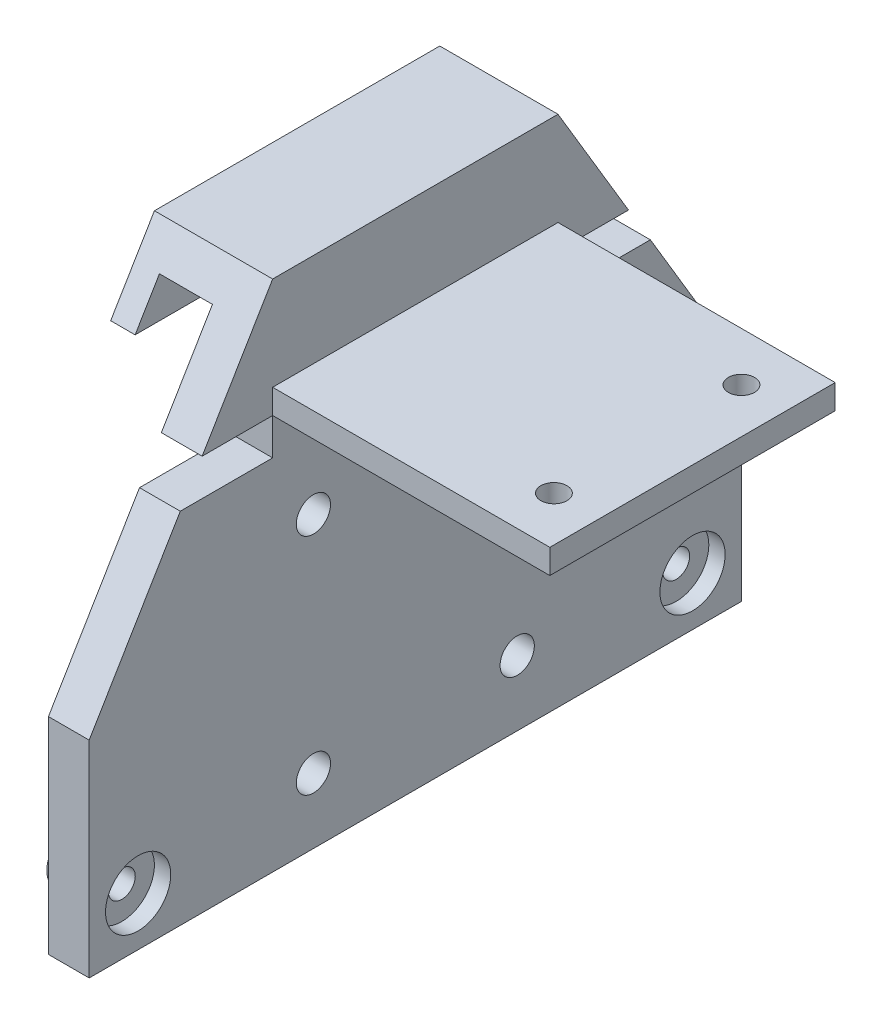
ISO-10303-21;
HEADER;
FILE_DESCRIPTION(('STEP AP214'),'2;1');
FILE_NAME('part.step','',(''),(''),'','','');
FILE_SCHEMA(('AUTOMOTIVE_DESIGN { 1 0 10303 214 1 1 1 1 }'));
ENDSEC;
DATA;
#1=APPLICATION_CONTEXT('core data for automotive mechanical design processes');
#2=APPLICATION_PROTOCOL_DEFINITION('international standard','automotive_design',2000,#1);
#3=PRODUCT_CONTEXT('',#1,'mechanical');
#4=PRODUCT('Part','Part','',(#3));
#5=PRODUCT_RELATED_PRODUCT_CATEGORY('part','',(#4));
#6=PRODUCT_DEFINITION_FORMATION('','',#4);
#7=PRODUCT_DEFINITION_CONTEXT('part definition',#1,'design');
#8=PRODUCT_DEFINITION('design','',#6,#7);
#9=PRODUCT_DEFINITION_SHAPE('','',#8);
#10=(LENGTH_UNIT() NAMED_UNIT(*) SI_UNIT(.MILLI.,.METRE.));
#11=(NAMED_UNIT(*) PLANE_ANGLE_UNIT() SI_UNIT($,.RADIAN.));
#12=(NAMED_UNIT(*) SI_UNIT($,.STERADIAN.) SOLID_ANGLE_UNIT());
#13=UNCERTAINTY_MEASURE_WITH_UNIT(LENGTH_MEASURE(1.E-05),#10,'distance_accuracy_value','');
#14=(GEOMETRIC_REPRESENTATION_CONTEXT(3) GLOBAL_UNCERTAINTY_ASSIGNED_CONTEXT((#13)) GLOBAL_UNIT_ASSIGNED_CONTEXT((#10,
#11,#12)) REPRESENTATION_CONTEXT('',''));
#15=CARTESIAN_POINT('',(0.,0.,0.));
#16=DIRECTION('',(0.,0.,1.));
#17=DIRECTION('',(1.,0.,0.));
#18=AXIS2_PLACEMENT_3D('',#15,#16,#17);
#19=CARTESIAN_POINT('',(5.,0.,0.));
#20=DIRECTION('',(1.,0.,0.));
#21=DIRECTION('',(0.,0.,-1.));
#22=AXIS2_PLACEMENT_3D('',#19,#20,#21);
#23=PLANE('',#22);
#24=DIRECTION('',(0.,1.,0.));
#25=VECTOR('',#24,1.);
#26=CARTESIAN_POINT('',(5.,17.,-17.5));
#27=LINE('',#26,#25);
#28=CARTESIAN_POINT('',(5.,17.,-17.5));
#29=VERTEX_POINT('',#28);
#30=CARTESIAN_POINT('',(5.,20.,-17.5));
#31=VERTEX_POINT('',#30);
#32=EDGE_CURVE('E209',#29,#31,#27,.T.);
#33=ORIENTED_EDGE('',*,*,#32,.F.);
#34=DIRECTION('',(0.,0.,1.));
#35=VECTOR('',#34,1.);
#36=CARTESIAN_POINT('',(5.,17.,-17.5));
#37=LINE('',#36,#35);
#38=CARTESIAN_POINT('',(5.,17.,-26.1466267724151));
#39=VERTEX_POINT('',#38);
#40=EDGE_CURVE('E241',#39,#29,#37,.T.);
#41=ORIENTED_EDGE('',*,*,#40,.F.);
#42=DIRECTION('',(0.,-0.858884544740258,-0.512169248204458));
#43=VECTOR('',#42,1.);
#44=CARTESIAN_POINT('',(5.,-6.23147709356677,-40.));
#45=LINE('',#44,#43);
#46=CARTESIAN_POINT('',(5.,31.5,-17.5));
#47=VERTEX_POINT('',#46);
#48=EDGE_CURVE('E335',#47,#39,#45,.T.);
#49=ORIENTED_EDGE('',*,*,#48,.F.);
#50=DIRECTION('',(0.,0.,1.));
#51=VECTOR('',#50,1.);
#52=CARTESIAN_POINT('',(5.,31.5,40.));
#53=LINE('',#52,#51);
#54=CARTESIAN_POINT('',(5.,31.5,17.5));
#55=VERTEX_POINT('',#54);
#56=EDGE_CURVE('E419',#47,#55,#53,.T.);
#57=ORIENTED_EDGE('',*,*,#56,.T.);
#58=DIRECTION('',(0.,0.858884544740258,-0.512169248204458));
#59=VECTOR('',#58,1.);
#60=CARTESIAN_POINT('',(5.,31.5,17.5));
#61=LINE('',#60,#59);
#62=CARTESIAN_POINT('',(5.,17.,26.1466267724151));
#63=VERTEX_POINT('',#62);
#64=EDGE_CURVE('E322',#63,#55,#61,.T.);
#65=ORIENTED_EDGE('',*,*,#64,.F.);
#66=DIRECTION('',(0.,0.,1.));
#67=VECTOR('',#66,1.);
#68=CARTESIAN_POINT('',(5.,17.,17.5));
#69=LINE('',#68,#67);
#70=CARTESIAN_POINT('',(5.,17.,17.5));
#71=VERTEX_POINT('',#70);
#72=EDGE_CURVE('E269',#71,#63,#69,.T.);
#73=ORIENTED_EDGE('',*,*,#72,.F.);
#74=DIRECTION('',(0.,-1.,0.));
#75=VECTOR('',#74,1.);
#76=CARTESIAN_POINT('',(5.,17.,17.5));
#77=LINE('',#76,#75);
#78=CARTESIAN_POINT('',(5.,20.,17.5));
#79=VERTEX_POINT('',#78);
#80=EDGE_CURVE('E498',#79,#71,#77,.T.);
#81=ORIENTED_EDGE('',*,*,#80,.F.);
#82=DIRECTION('',(0.,0.,1.));
#83=VECTOR('',#82,1.);
#84=CARTESIAN_POINT('',(5.,20.,17.5));
#85=LINE('',#84,#83);
#86=EDGE_CURVE('E58',#31,#79,#85,.T.);
#87=ORIENTED_EDGE('',*,*,#86,.F.);
#88=EDGE_LOOP('',(#33,#41,#49,#57,#65,#73,#81,#87));
#89=FACE_BOUND('',#88,.T.);
#90=ADVANCED_FACE('F40',(#89),#23,.T.);
#91=CARTESIAN_POINT('',(-9.5,-6.23147709356677,-40.));
#92=DIRECTION('',(0.,-0.512169248204458,0.858884544740258));
#93=DIRECTION('',(0.,-0.858884544740258,-0.512169248204458));
#94=AXIS2_PLACEMENT_3D('',#91,#92,#93);
#95=PLANE('',#94);
#96=ORIENTED_EDGE('',*,*,#48,.T.);
#97=DIRECTION('',(1.,0.,0.));
#98=VECTOR('',#97,1.);
#99=CARTESIAN_POINT('',(-9.501,17.,-26.1466267724151));
#100=LINE('',#99,#98);
#101=CARTESIAN_POINT('',(0.,17.,-26.1466267724151));
#102=VERTEX_POINT('',#101);
#103=EDGE_CURVE('E224',#102,#39,#100,.T.);
#104=ORIENTED_EDGE('',*,*,#103,.F.);
#105=DIRECTION('',(0.,-0.858884544740258,-0.512169248204458));
#106=VECTOR('',#105,1.);
#107=CARTESIAN_POINT('',(0.,15.9611455749449,-26.7661154954719));
#108=LINE('',#107,#106);
#109=CARTESIAN_POINT('',(0.,27.5,-19.8852763510111));
#110=VERTEX_POINT('',#109);
#111=EDGE_CURVE('E354',#110,#102,#108,.T.);
#112=ORIENTED_EDGE('',*,*,#111,.F.);
#113=DIRECTION('',(-1.,0.,0.));
#114=VECTOR('',#113,1.);
#115=CARTESIAN_POINT('',(0.,27.5,-19.8852763510111));
#116=LINE('',#115,#114);
#117=CARTESIAN_POINT('',(-6.5,27.5,-19.8852763510111));
#118=VERTEX_POINT('',#117);
#119=EDGE_CURVE('E350',#110,#118,#116,.T.);
#120=ORIENTED_EDGE('',*,*,#119,.T.);
#121=DIRECTION('',(0.,-0.858884544740258,-0.512169248204458));
#122=VECTOR('',#121,1.);
#123=CARTESIAN_POINT('',(-6.49999999999999,12.8950815209415,-28.5944680151467));
#124=LINE('',#123,#122);
#125=CARTESIAN_POINT('',(-6.5,22.5,-22.8668717897749));
#126=VERTEX_POINT('',#125);
#127=EDGE_CURVE('E347',#118,#126,#124,.T.);
#128=ORIENTED_EDGE('',*,*,#127,.T.);
#129=DIRECTION('',(-1.,0.,0.));
#130=VECTOR('',#129,1.);
#131=CARTESIAN_POINT('',(-6.5,22.5,-22.8668717897749));
#132=LINE('',#131,#130);
#133=CARTESIAN_POINT('',(-9.5,22.5,-22.8668717897749));
#134=VERTEX_POINT('',#133);
#135=EDGE_CURVE('E327',#126,#134,#132,.T.);
#136=ORIENTED_EDGE('',*,*,#135,.T.);
#137=DIRECTION('',(0.,-0.858884544740258,-0.512169248204458));
#138=VECTOR('',#137,1.);
#139=CARTESIAN_POINT('',(-9.5,-6.23147709356677,-40.));
#140=LINE('',#139,#138);
#141=CARTESIAN_POINT('',(-9.5,31.5,-17.5));
#142=VERTEX_POINT('',#141);
#143=EDGE_CURVE('E330',#142,#134,#140,.T.);
#144=ORIENTED_EDGE('',*,*,#143,.F.);
#145=DIRECTION('',(1.,0.,0.));
#146=VECTOR('',#145,1.);
#147=CARTESIAN_POINT('',(-9.5,31.5,-17.5));
#148=LINE('',#147,#146);
#149=EDGE_CURVE('E339',#142,#47,#148,.T.);
#150=ORIENTED_EDGE('',*,*,#149,.T.);
#151=EDGE_LOOP('',(#96,#104,#112,#120,#128,#136,#144,#150));
#152=FACE_BOUND('',#151,.T.);
#153=ADVANCED_FACE('F575',(#152),#95,.F.);
#154=CARTESIAN_POINT('',(-9.5,31.5,17.5));
#155=DIRECTION('',(0.,-0.512169248204458,-0.858884544740258));
#156=DIRECTION('',(0.,0.858884544740258,-0.512169248204458));
#157=AXIS2_PLACEMENT_3D('',#154,#155,#156);
#158=PLANE('',#157);
#159=CARTESIAN_POINT('',(5.,-6.23147709356677,40.));
#160=VERTEX_POINT('',#159);
#161=CARTESIAN_POINT('',(5.,12.5,28.8300626673025));
#162=VERTEX_POINT('',#161);
#163=EDGE_CURVE('E317',#160,#162,#61,.T.);
#164=ORIENTED_EDGE('',*,*,#163,.T.);
#165=DIRECTION('',(1.,0.,0.));
#166=VECTOR('',#165,1.);
#167=CARTESIAN_POINT('',(-9.501,12.5,28.8300626673025));
#168=LINE('',#167,#166);
#169=CARTESIAN_POINT('',(0.,12.5,28.8300626673025));
#170=VERTEX_POINT('',#169);
#171=EDGE_CURVE('E215',#170,#162,#168,.T.);
#172=ORIENTED_EDGE('',*,*,#171,.F.);
#173=DIRECTION('',(0.,0.858884544740258,-0.512169248204458));
#174=VECTOR('',#173,1.);
#175=CARTESIAN_POINT('',(0.,15.9611455749449,26.7661154954719));
#176=LINE('',#175,#174);
#177=CARTESIAN_POINT('',(0.,-6.23147709356677,40.));
#178=VERTEX_POINT('',#177);
#179=EDGE_CURVE('E369',#178,#170,#176,.T.);
#180=ORIENTED_EDGE('',*,*,#179,.F.);
#181=DIRECTION('',(1.,0.,0.));
#182=VECTOR('',#181,1.);
#183=CARTESIAN_POINT('',(-9.5,-6.23147709356677,40.));
#184=LINE('',#183,#182);
#185=EDGE_CURVE('E321',#178,#160,#184,.T.);
#186=ORIENTED_EDGE('',*,*,#185,.T.);
#187=EDGE_LOOP('',(#164,#172,#180,#186));
#188=FACE_BOUND('',#187,.T.);
#189=ADVANCED_FACE('F573',(#188),#158,.F.);
#190=CARTESIAN_POINT('',(0.,0.,0.));
#191=DIRECTION('',(1.,0.,0.));
#192=DIRECTION('',(0.,0.,-1.));
#193=AXIS2_PLACEMENT_3D('',#190,#191,#192);
#194=PLANE('',#193);
#195=CARTESIAN_POINT('',(0.,-23.5,-12.5));
#196=DIRECTION('',(-1.,0.,0.));
#197=DIRECTION('',(0.,0.,1.));
#198=AXIS2_PLACEMENT_3D('',#195,#196,#197);
#199=CIRCLE('',#198,2.1);
#200=CARTESIAN_POINT('',(0.,-23.5,-10.4));
#201=VERTEX_POINT('',#200);
#202=EDGE_CURVE('E290',#201,#201,#199,.T.);
#203=ORIENTED_EDGE('',*,*,#202,.F.);
#204=EDGE_LOOP('',(#203));
#205=FACE_BOUND('',#204,.T.);
#206=CARTESIAN_POINT('',(0.,-23.5,12.5));
#207=DIRECTION('',(-1.,0.,0.));
#208=DIRECTION('',(0.,0.,1.));
#209=AXIS2_PLACEMENT_3D('',#206,#207,#208);
#210=CIRCLE('',#209,2.1);
#211=CARTESIAN_POINT('',(0.,-23.5,14.6));
#212=VERTEX_POINT('',#211);
#213=EDGE_CURVE('E255',#212,#212,#210,.T.);
#214=ORIENTED_EDGE('',*,*,#213,.F.);
#215=EDGE_LOOP('',(#214));
#216=FACE_BOUND('',#215,.T.);
#217=CARTESIAN_POINT('',(0.,4.,12.5));
#218=DIRECTION('',(1.,0.,0.));
#219=DIRECTION('',(0.,0.,-1.));
#220=AXIS2_PLACEMENT_3D('',#217,#218,#219);
#221=CIRCLE('',#220,2.1);
#222=CARTESIAN_POINT('',(0.,4.,10.4));
#223=VERTEX_POINT('',#222);
#224=EDGE_CURVE('E312',#223,#223,#221,.T.);
#225=ORIENTED_EDGE('',*,*,#224,.T.);
#226=EDGE_LOOP('',(#225));
#227=FACE_BOUND('',#226,.T.);
#228=CARTESIAN_POINT('',(0.,4.,-12.5));
#229=DIRECTION('',(1.,0.,0.));
#230=DIRECTION('',(0.,0.,-1.));
#231=AXIS2_PLACEMENT_3D('',#228,#229,#230);
#232=CIRCLE('',#231,2.1);
#233=CARTESIAN_POINT('',(0.,4.,-14.6));
#234=VERTEX_POINT('',#233);
#235=EDGE_CURVE('E305',#234,#234,#232,.T.);
#236=ORIENTED_EDGE('',*,*,#235,.T.);
#237=EDGE_LOOP('',(#236));
#238=FACE_BOUND('',#237,.T.);
#239=CARTESIAN_POINT('',(0.,-25.5,-34.));
#240=DIRECTION('',(1.,0.,0.));
#241=DIRECTION('',(0.,0.,-1.));
#242=AXIS2_PLACEMENT_3D('',#239,#240,#241);
#243=CIRCLE('',#242,3.2);
#244=CARTESIAN_POINT('',(0.,-25.5,-37.2));
#245=VERTEX_POINT('',#244);
#246=EDGE_CURVE('E456',#245,#245,#243,.F.);
#247=ORIENTED_EDGE('',*,*,#246,.F.);
#248=EDGE_LOOP('',(#247));
#249=FACE_BOUND('',#248,.T.);
#250=ORIENTED_EDGE('',*,*,#111,.T.);
#251=DIRECTION('',(0.,0.,-1.));
#252=VECTOR('',#251,1.);
#253=CARTESIAN_POINT('',(0.,17.,-17.5));
#254=LINE('',#253,#252);
#255=CARTESIAN_POINT('',(0.,17.,-17.5));
#256=VERTEX_POINT('',#255);
#257=EDGE_CURVE('E232',#256,#102,#254,.T.);
#258=ORIENTED_EDGE('',*,*,#257,.F.);
#259=DIRECTION('',(0.,1.,0.));
#260=VECTOR('',#259,1.);
#261=CARTESIAN_POINT('',(0.,17.,-17.5));
#262=LINE('',#261,#260);
#263=CARTESIAN_POINT('',(0.,12.5,-17.5));
#264=VERTEX_POINT('',#263);
#265=EDGE_CURVE('E228',#264,#256,#262,.T.);
#266=ORIENTED_EDGE('',*,*,#265,.F.);
#267=DIRECTION('',(0.,0.,1.));
#268=VECTOR('',#267,1.);
#269=CARTESIAN_POINT('',(0.,12.5,-17.5));
#270=LINE('',#269,#268);
#271=CARTESIAN_POINT('',(0.,12.5,-28.8300626673025));
#272=VERTEX_POINT('',#271);
#273=EDGE_CURVE('E250',#272,#264,#270,.T.);
#274=ORIENTED_EDGE('',*,*,#273,.F.);
#275=CARTESIAN_POINT('',(0.,-6.23147709356677,-40.));
#276=VERTEX_POINT('',#275);
#277=EDGE_CURVE('E353',#272,#276,#108,.T.);
#278=ORIENTED_EDGE('',*,*,#277,.T.);
#279=DIRECTION('',(0.,1.,0.));
#280=VECTOR('',#279,1.);
#281=CARTESIAN_POINT('',(0.,31.5,-40.));
#282=LINE('',#281,#280);
#283=CARTESIAN_POINT('',(0.,-31.5,-40.));
#284=VERTEX_POINT('',#283);
#285=EDGE_CURVE('E437',#284,#276,#282,.T.);
#286=ORIENTED_EDGE('',*,*,#285,.F.);
#287=DIRECTION('',(0.,0.,-1.));
#288=VECTOR('',#287,1.);
#289=CARTESIAN_POINT('',(0.,-31.5,40.));
#290=LINE('',#289,#288);
#291=CARTESIAN_POINT('',(0.,-31.5,40.));
#292=VERTEX_POINT('',#291);
#293=EDGE_CURVE('E445',#292,#284,#290,.T.);
#294=ORIENTED_EDGE('',*,*,#293,.F.);
#295=DIRECTION('',(0.,-1.,0.));
#296=VECTOR('',#295,1.);
#297=CARTESIAN_POINT('',(0.,31.5,40.));
#298=LINE('',#297,#296);
#299=EDGE_CURVE('E441',#178,#292,#298,.T.);
#300=ORIENTED_EDGE('',*,*,#299,.F.);
#301=ORIENTED_EDGE('',*,*,#179,.T.);
#302=DIRECTION('',(0.,0.,1.));
#303=VECTOR('',#302,1.);
#304=CARTESIAN_POINT('',(0.,12.5,17.5));
#305=LINE('',#304,#303);
#306=CARTESIAN_POINT('',(0.,12.5,17.5));
#307=VERTEX_POINT('',#306);
#308=EDGE_CURVE('E262',#307,#170,#305,.T.);
#309=ORIENTED_EDGE('',*,*,#308,.F.);
#310=DIRECTION('',(0.,-1.,0.));
#311=VECTOR('',#310,1.);
#312=CARTESIAN_POINT('',(0.,17.,17.5));
#313=LINE('',#312,#311);
#314=CARTESIAN_POINT('',(0.,17.,17.5));
#315=VERTEX_POINT('',#314);
#316=EDGE_CURVE('E259',#315,#307,#313,.T.);
#317=ORIENTED_EDGE('',*,*,#316,.F.);
#318=DIRECTION('',(0.,0.,-1.));
#319=VECTOR('',#318,1.);
#320=CARTESIAN_POINT('',(0.,17.,17.5));
#321=LINE('',#320,#319);
#322=CARTESIAN_POINT('',(0.,17.,26.1466267724151));
#323=VERTEX_POINT('',#322);
#324=EDGE_CURVE('E225',#323,#315,#321,.T.);
#325=ORIENTED_EDGE('',*,*,#324,.F.);
#326=CARTESIAN_POINT('',(0.,27.5,19.8852763510111));
#327=VERTEX_POINT('',#326);
#328=EDGE_CURVE('E368',#323,#327,#176,.T.);
#329=ORIENTED_EDGE('',*,*,#328,.T.);
#330=DIRECTION('',(0.,0.,1.));
#331=VECTOR('',#330,1.);
#332=CARTESIAN_POINT('',(0.,27.5,-53.0862523283024));
#333=LINE('',#332,#331);
#334=EDGE_CURVE('E374',#110,#327,#333,.T.);
#335=ORIENTED_EDGE('',*,*,#334,.F.);
#336=EDGE_LOOP('',(#250,#258,#266,#274,#278,#286,#294,#300,#301,#309,#317,#325,#329,#335));
#337=FACE_BOUND('',#336,.T.);
#338=CARTESIAN_POINT('',(0.,-25.5,34.));
#339=DIRECTION('',(1.,0.,0.));
#340=DIRECTION('',(0.,0.,-1.));
#341=AXIS2_PLACEMENT_3D('',#338,#339,#340);
#342=CIRCLE('',#341,3.2);
#343=CARTESIAN_POINT('',(0.,-25.5,30.8));
#344=VERTEX_POINT('',#343);
#345=EDGE_CURVE('E50',#344,#344,#342,.F.);
#346=ORIENTED_EDGE('',*,*,#345,.F.);
#347=EDGE_LOOP('',(#346));
#348=FACE_BOUND('',#347,.T.);
#349=ADVANCED_FACE('F553',(#205,#216,#227,#238,#249,#337,#348),#194,.F.);
#350=CARTESIAN_POINT('',(10.,31.5,-40.));
#351=DIRECTION('',(0.,0.,1.));
#352=DIRECTION('',(0.,-1.,0.));
#353=AXIS2_PLACEMENT_3D('',#350,#351,#352);
#354=PLANE('',#353);
#355=ORIENTED_EDGE('',*,*,#285,.T.);
#356=DIRECTION('',(1.,0.,0.));
#357=VECTOR('',#356,1.);
#358=CARTESIAN_POINT('',(-9.5,-6.23147709356677,-40.));
#359=LINE('',#358,#357);
#360=CARTESIAN_POINT('',(5.,-6.23147709356677,-40.));
#361=VERTEX_POINT('',#360);
#362=EDGE_CURVE('E334',#276,#361,#359,.T.);
#363=ORIENTED_EDGE('',*,*,#362,.T.);
#364=DIRECTION('',(0.,1.,0.));
#365=VECTOR('',#364,1.);
#366=CARTESIAN_POINT('',(5.,31.5,-40.));
#367=LINE('',#366,#365);
#368=CARTESIAN_POINT('',(5.,-31.5,-40.));
#369=VERTEX_POINT('',#368);
#370=EDGE_CURVE('E415',#369,#361,#367,.T.);
#371=ORIENTED_EDGE('',*,*,#370,.F.);
#372=DIRECTION('',(-1.,0.,0.));
#373=VECTOR('',#372,1.);
#374=CARTESIAN_POINT('',(10.,-31.5,-40.));
#375=LINE('',#374,#373);
#376=EDGE_CURVE('E449',#369,#284,#375,.T.);
#377=ORIENTED_EDGE('',*,*,#376,.T.);
#378=EDGE_LOOP('',(#355,#363,#371,#377));
#379=FACE_BOUND('',#378,.T.);
#380=ADVANCED_FACE('F42',(#379),#354,.F.);
#381=CARTESIAN_POINT('',(10.,31.5,40.));
#382=DIRECTION('',(0.,-1.,0.));
#383=DIRECTION('',(0.,0.,-1.));
#384=AXIS2_PLACEMENT_3D('',#381,#382,#383);
#385=PLANE('',#384);
#386=DIRECTION('',(0.,0.,1.));
#387=VECTOR('',#386,1.);
#388=CARTESIAN_POINT('',(-9.5,31.5,-53.0862523283024));
#389=LINE('',#388,#387);
#390=CARTESIAN_POINT('',(-9.5,31.5,17.5));
#391=VERTEX_POINT('',#390);
#392=EDGE_CURVE('E373',#142,#391,#389,.T.);
#393=ORIENTED_EDGE('',*,*,#392,.T.);
#394=DIRECTION('',(1.,0.,0.));
#395=VECTOR('',#394,1.);
#396=CARTESIAN_POINT('',(-9.5,31.5,17.5));
#397=LINE('',#396,#395);
#398=EDGE_CURVE('E323',#391,#55,#397,.T.);
#399=ORIENTED_EDGE('',*,*,#398,.T.);
#400=ORIENTED_EDGE('',*,*,#56,.F.);
#401=ORIENTED_EDGE('',*,*,#149,.F.);
#402=EDGE_LOOP('',(#393,#399,#400,#401));
#403=FACE_BOUND('',#402,.T.);
#404=ADVANCED_FACE('F635',(#403),#385,.F.);
#405=CARTESIAN_POINT('',(10.,31.5,40.));
#406=DIRECTION('',(0.,0.,-1.));
#407=DIRECTION('',(-1.,0.,0.));
#408=AXIS2_PLACEMENT_3D('',#405,#406,#407);
#409=PLANE('',#408);
#410=DIRECTION('',(0.,-1.,0.));
#411=VECTOR('',#410,1.);
#412=CARTESIAN_POINT('',(5.,31.5,40.));
#413=LINE('',#412,#411);
#414=CARTESIAN_POINT('',(5.,-31.5,40.));
#415=VERTEX_POINT('',#414);
#416=EDGE_CURVE('E409',#160,#415,#413,.T.);
#417=ORIENTED_EDGE('',*,*,#416,.F.);
#418=ORIENTED_EDGE('',*,*,#185,.F.);
#419=ORIENTED_EDGE('',*,*,#299,.T.);
#420=DIRECTION('',(-1.,0.,0.));
#421=VECTOR('',#420,1.);
#422=CARTESIAN_POINT('',(10.,-31.5,40.));
#423=LINE('',#422,#421);
#424=EDGE_CURVE('E452',#415,#292,#423,.T.);
#425=ORIENTED_EDGE('',*,*,#424,.F.);
#426=EDGE_LOOP('',(#417,#418,#419,#425));
#427=FACE_BOUND('',#426,.T.);
#428=ADVANCED_FACE('F550',(#427),#409,.F.);
#429=CARTESIAN_POINT('',(10.,-31.5,40.));
#430=DIRECTION('',(0.,1.,0.));
#431=DIRECTION('',(0.,0.,1.));
#432=AXIS2_PLACEMENT_3D('',#429,#430,#431);
#433=PLANE('',#432);
#434=DIRECTION('',(0.,0.,-1.));
#435=VECTOR('',#434,1.);
#436=CARTESIAN_POINT('',(5.,-31.5,40.));
#437=LINE('',#436,#435);
#438=EDGE_CURVE('E412',#415,#369,#437,.T.);
#439=ORIENTED_EDGE('',*,*,#438,.F.);
#440=ORIENTED_EDGE('',*,*,#424,.T.);
#441=ORIENTED_EDGE('',*,*,#293,.T.);
#442=ORIENTED_EDGE('',*,*,#376,.F.);
#443=EDGE_LOOP('',(#439,#440,#441,#442));
#444=FACE_BOUND('',#443,.T.);
#445=ADVANCED_FACE('F547',(#444),#433,.F.);
#446=CARTESIAN_POINT('',(-11.3137084989848,-25.5,-34.));
#447=DIRECTION('',(1.,0.,0.));
#448=DIRECTION('',(0.,0.,-1.));
#449=AXIS2_PLACEMENT_3D('',#446,#447,#448);
#450=CYLINDRICAL_SURFACE('',#449,4.00000000000001);
#451=CARTESIAN_POINT('',(3.,-25.5,-34.));
#452=DIRECTION('',(1.,0.,0.));
#453=DIRECTION('',(0.,0.,-1.));
#454=AXIS2_PLACEMENT_3D('',#451,#452,#453);
#455=CIRCLE('',#454,4.00000000000001);
#456=CARTESIAN_POINT('',(3.,-25.5,-38.));
#457=VERTEX_POINT('',#456);
#458=EDGE_CURVE('E428',#457,#457,#455,.F.);
#459=ORIENTED_EDGE('',*,*,#458,.T.);
#460=EDGE_LOOP('',(#459));
#461=FACE_BOUND('',#460,.T.);
#462=CARTESIAN_POINT('',(5.,-25.5,-34.));
#463=DIRECTION('',(1.,0.,0.));
#464=DIRECTION('',(0.,0.,-1.));
#465=AXIS2_PLACEMENT_3D('',#462,#463,#464);
#466=CIRCLE('',#465,4.00000000000001);
#467=CARTESIAN_POINT('',(5.,-25.5,-38.));
#468=VERTEX_POINT('',#467);
#469=EDGE_CURVE('E424',#468,#468,#466,.F.);
#470=ORIENTED_EDGE('',*,*,#469,.F.);
#471=EDGE_LOOP('',(#470));
#472=FACE_BOUND('',#471,.T.);
#473=ADVANCED_FACE('F620',(#461,#472),#450,.F.);
#474=CARTESIAN_POINT('',(-11.3137084989848,-25.5,34.));
#475=DIRECTION('',(1.,0.,0.));
#476=DIRECTION('',(0.,0.,-1.));
#477=AXIS2_PLACEMENT_3D('',#474,#475,#476);
#478=CYLINDRICAL_SURFACE('',#477,4.);
#479=CARTESIAN_POINT('',(3.,-25.5,34.));
#480=DIRECTION('',(1.,0.,0.));
#481=DIRECTION('',(0.,0.,-1.));
#482=AXIS2_PLACEMENT_3D('',#479,#480,#481);
#483=CIRCLE('',#482,4.);
#484=CARTESIAN_POINT('',(3.,-25.5,30.));
#485=VERTEX_POINT('',#484);
#486=EDGE_CURVE('E429',#485,#485,#483,.F.);
#487=ORIENTED_EDGE('',*,*,#486,.T.);
#488=EDGE_LOOP('',(#487));
#489=FACE_BOUND('',#488,.T.);
#490=CARTESIAN_POINT('',(5.,-25.5,34.));
#491=DIRECTION('',(1.,0.,0.));
#492=DIRECTION('',(0.,0.,-1.));
#493=AXIS2_PLACEMENT_3D('',#490,#491,#492);
#494=CIRCLE('',#493,4.);
#495=CARTESIAN_POINT('',(5.,-25.5,30.));
#496=VERTEX_POINT('',#495);
#497=EDGE_CURVE('E423',#496,#496,#494,.F.);
#498=ORIENTED_EDGE('',*,*,#497,.F.);
#499=EDGE_LOOP('',(#498));
#500=FACE_BOUND('',#499,.T.);
#501=ADVANCED_FACE('F617',(#489,#500),#478,.F.);
#502=CARTESIAN_POINT('',(10.,-25.5,34.));
#503=DIRECTION('',(-1.,0.,0.));
#504=DIRECTION('',(0.,0.,1.));
#505=AXIS2_PLACEMENT_3D('',#502,#503,#504);
#506=CYLINDRICAL_SURFACE('',#505,1.65);
#507=CARTESIAN_POINT('',(3.,-25.5,34.));
#508=DIRECTION('',(1.,0.,0.));
#509=DIRECTION('',(0.,0.,-1.));
#510=AXIS2_PLACEMENT_3D('',#507,#508,#509);
#511=CIRCLE('',#510,1.65);
#512=CARTESIAN_POINT('',(3.,-25.5,32.35));
#513=VERTEX_POINT('',#512);
#514=EDGE_CURVE('E442',#513,#513,#511,.T.);
#515=ORIENTED_EDGE('',*,*,#514,.T.);
#516=EDGE_LOOP('',(#515));
#517=FACE_BOUND('',#516,.T.);
#518=CARTESIAN_POINT('',(-3.,-25.5,34.));
#519=DIRECTION('',(-1.,0.,0.));
#520=DIRECTION('',(0.,0.,1.));
#521=AXIS2_PLACEMENT_3D('',#518,#519,#520);
#522=CIRCLE('',#521,1.65);
#523=CARTESIAN_POINT('',(-3.,-25.5,35.65));
#524=VERTEX_POINT('',#523);
#525=EDGE_CURVE('E378',#524,#524,#522,.T.);
#526=ORIENTED_EDGE('',*,*,#525,.T.);
#527=EDGE_LOOP('',(#526));
#528=FACE_BOUND('',#527,.T.);
#529=ADVANCED_FACE('F619',(#517,#528),#506,.F.);
#530=CARTESIAN_POINT('',(10.,-25.5,-34.));
#531=DIRECTION('',(-1.,0.,0.));
#532=DIRECTION('',(0.,0.,1.));
#533=AXIS2_PLACEMENT_3D('',#530,#531,#532);
#534=CYLINDRICAL_SURFACE('',#533,1.65);
#535=CARTESIAN_POINT('',(3.,-25.5,-34.));
#536=DIRECTION('',(1.,0.,0.));
#537=DIRECTION('',(0.,0.,-1.));
#538=AXIS2_PLACEMENT_3D('',#535,#536,#537);
#539=CIRCLE('',#538,1.65);
#540=CARTESIAN_POINT('',(3.,-25.5,-35.65));
#541=VERTEX_POINT('',#540);
#542=EDGE_CURVE('E433',#541,#541,#539,.T.);
#543=ORIENTED_EDGE('',*,*,#542,.T.);
#544=EDGE_LOOP('',(#543));
#545=FACE_BOUND('',#544,.T.);
#546=CARTESIAN_POINT('',(-3.,-25.5,-34.));
#547=DIRECTION('',(-1.,0.,0.));
#548=DIRECTION('',(0.,0.,1.));
#549=AXIS2_PLACEMENT_3D('',#546,#547,#548);
#550=CIRCLE('',#549,1.65000000000001);
#551=CARTESIAN_POINT('',(-3.,-25.5,-32.35));
#552=VERTEX_POINT('',#551);
#553=EDGE_CURVE('E401',#552,#552,#550,.T.);
#554=ORIENTED_EDGE('',*,*,#553,.T.);
#555=EDGE_LOOP('',(#554));
#556=FACE_BOUND('',#555,.T.);
#557=ADVANCED_FACE('F611',(#545,#556),#534,.F.);
#558=CARTESIAN_POINT('',(3.,0.,0.));
#559=DIRECTION('',(1.,0.,0.));
#560=DIRECTION('',(0.,0.,-1.));
#561=AXIS2_PLACEMENT_3D('',#558,#559,#560);
#562=PLANE('',#561);
#563=ORIENTED_EDGE('',*,*,#542,.F.);
#564=EDGE_LOOP('',(#563));
#565=FACE_BOUND('',#564,.T.);
#566=ORIENTED_EDGE('',*,*,#458,.F.);
#567=EDGE_LOOP('',(#566));
#568=FACE_BOUND('',#567,.T.);
#569=ADVANCED_FACE('F606',(#565,#568),#562,.T.);
#570=CARTESIAN_POINT('',(3.,0.,0.));
#571=DIRECTION('',(1.,0.,0.));
#572=DIRECTION('',(0.,0.,-1.));
#573=AXIS2_PLACEMENT_3D('',#570,#571,#572);
#574=PLANE('',#573);
#575=ORIENTED_EDGE('',*,*,#514,.F.);
#576=EDGE_LOOP('',(#575));
#577=FACE_BOUND('',#576,.T.);
#578=ORIENTED_EDGE('',*,*,#486,.F.);
#579=EDGE_LOOP('',(#578));
#580=FACE_BOUND('',#579,.T.);
#581=ADVANCED_FACE('F597',(#577,#580),#574,.T.);
#582=DIRECTION('',(0.,0.,-1.));
#583=VECTOR('',#582,1.);
#584=CARTESIAN_POINT('',(5.,17.,17.5));
#585=LINE('',#584,#583);
#586=EDGE_CURVE('E206',#71,#29,#585,.T.);
#587=ORIENTED_EDGE('',*,*,#586,.F.);
#588=DIRECTION('',(0.,1.,0.));
#589=VECTOR('',#588,1.);
#590=CARTESIAN_POINT('',(5.,17.,17.5));
#591=LINE('',#590,#589);
#592=CARTESIAN_POINT('',(5.,12.5,17.5));
#593=VERTEX_POINT('',#592);
#594=EDGE_CURVE('E265',#593,#71,#591,.T.);
#595=ORIENTED_EDGE('',*,*,#594,.F.);
#596=DIRECTION('',(0.,0.,-1.));
#597=VECTOR('',#596,1.);
#598=CARTESIAN_POINT('',(5.,12.5,17.5));
#599=LINE('',#598,#597);
#600=EDGE_CURVE('E272',#162,#593,#599,.T.);
#601=ORIENTED_EDGE('',*,*,#600,.F.);
#602=ORIENTED_EDGE('',*,*,#163,.F.);
#603=ORIENTED_EDGE('',*,*,#416,.T.);
#604=ORIENTED_EDGE('',*,*,#438,.T.);
#605=ORIENTED_EDGE('',*,*,#370,.T.);
#606=CARTESIAN_POINT('',(5.,12.5,-28.8300626673025));
#607=VERTEX_POINT('',#606);
#608=EDGE_CURVE('E316',#607,#361,#45,.T.);
#609=ORIENTED_EDGE('',*,*,#608,.F.);
#610=DIRECTION('',(0.,0.,-1.));
#611=VECTOR('',#610,1.);
#612=CARTESIAN_POINT('',(5.,12.5,-17.5));
#613=LINE('',#612,#611);
#614=CARTESIAN_POINT('',(5.,12.5,-17.5));
#615=VERTEX_POINT('',#614);
#616=EDGE_CURVE('E66',#615,#607,#613,.T.);
#617=ORIENTED_EDGE('',*,*,#616,.F.);
#618=DIRECTION('',(0.,-1.,0.));
#619=VECTOR('',#618,1.);
#620=CARTESIAN_POINT('',(5.,17.,-17.5));
#621=LINE('',#620,#619);
#622=EDGE_CURVE('E235',#29,#615,#621,.T.);
#623=ORIENTED_EDGE('',*,*,#622,.F.);
#624=EDGE_LOOP('',(#587,#595,#601,#602,#603,#604,#605,#609,#617,#623));
#625=FACE_BOUND('',#624,.T.);
#626=CARTESIAN_POINT('',(5.,-23.5,-12.5));
#627=DIRECTION('',(-1.,0.,0.));
#628=DIRECTION('',(0.,0.,1.));
#629=AXIS2_PLACEMENT_3D('',#626,#627,#628);
#630=CIRCLE('',#629,2.1);
#631=CARTESIAN_POINT('',(5.,-23.5,-10.4));
#632=VERTEX_POINT('',#631);
#633=EDGE_CURVE('E285',#632,#632,#630,.T.);
#634=ORIENTED_EDGE('',*,*,#633,.T.);
#635=EDGE_LOOP('',(#634));
#636=FACE_BOUND('',#635,.T.);
#637=CARTESIAN_POINT('',(5.,-23.5,12.5));
#638=DIRECTION('',(-1.,0.,0.));
#639=DIRECTION('',(0.,0.,1.));
#640=AXIS2_PLACEMENT_3D('',#637,#638,#639);
#641=CIRCLE('',#640,2.1);
#642=CARTESIAN_POINT('',(5.,-23.5,14.6));
#643=VERTEX_POINT('',#642);
#644=EDGE_CURVE('E294',#643,#643,#641,.T.);
#645=ORIENTED_EDGE('',*,*,#644,.T.);
#646=EDGE_LOOP('',(#645));
#647=FACE_BOUND('',#646,.T.);
#648=CARTESIAN_POINT('',(5.,4.,12.5));
#649=DIRECTION('',(1.,0.,0.));
#650=DIRECTION('',(0.,0.,-1.));
#651=AXIS2_PLACEMENT_3D('',#648,#649,#650);
#652=CIRCLE('',#651,2.1);
#653=CARTESIAN_POINT('',(5.,4.,10.4));
#654=VERTEX_POINT('',#653);
#655=EDGE_CURVE('E301',#654,#654,#652,.T.);
#656=ORIENTED_EDGE('',*,*,#655,.F.);
#657=EDGE_LOOP('',(#656));
#658=FACE_BOUND('',#657,.T.);
#659=CARTESIAN_POINT('',(5.,4.,-12.5));
#660=DIRECTION('',(1.,0.,0.));
#661=DIRECTION('',(0.,0.,-1.));
#662=AXIS2_PLACEMENT_3D('',#659,#660,#661);
#663=CIRCLE('',#662,2.1);
#664=CARTESIAN_POINT('',(5.,4.,-14.6));
#665=VERTEX_POINT('',#664);
#666=EDGE_CURVE('E289',#665,#665,#663,.T.);
#667=ORIENTED_EDGE('',*,*,#666,.F.);
#668=EDGE_LOOP('',(#667));
#669=FACE_BOUND('',#668,.T.);
#670=ORIENTED_EDGE('',*,*,#497,.T.);
#671=EDGE_LOOP('',(#670));
#672=FACE_BOUND('',#671,.T.);
#673=ORIENTED_EDGE('',*,*,#469,.T.);
#674=EDGE_LOOP('',(#673));
#675=FACE_BOUND('',#674,.T.);
#676=ADVANCED_FACE('F540',(#625,#636,#647,#658,#669,#672,#675),#23,.T.);
#677=CARTESIAN_POINT('',(-3.,-25.5,-34.));
#678=DIRECTION('',(-1.,0.,0.));
#679=DIRECTION('',(0.,0.,1.));
#680=AXIS2_PLACEMENT_3D('',#677,#678,#679);
#681=PLANE('',#680);
#682=CARTESIAN_POINT('',(-3.,-25.5,-34.));
#683=DIRECTION('',(-1.,0.,0.));
#684=DIRECTION('',(0.,0.,1.));
#685=AXIS2_PLACEMENT_3D('',#682,#683,#684);
#686=CIRCLE('',#685,3.2);
#687=CARTESIAN_POINT('',(-3.,-25.5,-30.8));
#688=VERTEX_POINT('',#687);
#689=EDGE_CURVE('E405',#688,#688,#686,.T.);
#690=ORIENTED_EDGE('',*,*,#689,.T.);
#691=EDGE_LOOP('',(#690));
#692=FACE_BOUND('',#691,.T.);
#693=ORIENTED_EDGE('',*,*,#553,.F.);
#694=EDGE_LOOP('',(#693));
#695=FACE_BOUND('',#694,.T.);
#696=ADVANCED_FACE('F596',(#692,#695),#681,.T.);
#697=CARTESIAN_POINT('',(-3.,-25.5,-34.));
#698=DIRECTION('',(1.,0.,0.));
#699=DIRECTION('',(0.,0.,-1.));
#700=AXIS2_PLACEMENT_3D('',#697,#698,#699);
#701=CYLINDRICAL_SURFACE('',#700,3.2);
#702=ORIENTED_EDGE('',*,*,#689,.F.);
#703=EDGE_LOOP('',(#702));
#704=FACE_BOUND('',#703,.T.);
#705=ORIENTED_EDGE('',*,*,#246,.T.);
#706=EDGE_LOOP('',(#705));
#707=FACE_BOUND('',#706,.T.);
#708=ADVANCED_FACE('F602',(#704,#707),#701,.T.);
#709=CARTESIAN_POINT('',(-3.,-25.5,34.));
#710=DIRECTION('',(-1.,0.,0.));
#711=DIRECTION('',(0.,0.,1.));
#712=AXIS2_PLACEMENT_3D('',#709,#710,#711);
#713=PLANE('',#712);
#714=CARTESIAN_POINT('',(-3.,-25.5,34.));
#715=DIRECTION('',(-1.,0.,0.));
#716=DIRECTION('',(0.,0.,1.));
#717=AXIS2_PLACEMENT_3D('',#714,#715,#716);
#718=CIRCLE('',#717,3.2);
#719=CARTESIAN_POINT('',(-3.,-25.5,37.2));
#720=VERTEX_POINT('',#719);
#721=EDGE_CURVE('E397',#720,#720,#718,.T.);
#722=ORIENTED_EDGE('',*,*,#721,.T.);
#723=EDGE_LOOP('',(#722));
#724=FACE_BOUND('',#723,.T.);
#725=ORIENTED_EDGE('',*,*,#525,.F.);
#726=EDGE_LOOP('',(#725));
#727=FACE_BOUND('',#726,.T.);
#728=ADVANCED_FACE('F707',(#724,#727),#713,.T.);
#729=CARTESIAN_POINT('',(-3.,-25.5,34.));
#730=DIRECTION('',(1.,0.,0.));
#731=DIRECTION('',(0.,0.,-1.));
#732=AXIS2_PLACEMENT_3D('',#729,#730,#731);
#733=CYLINDRICAL_SURFACE('',#732,3.2);
#734=ORIENTED_EDGE('',*,*,#721,.F.);
#735=EDGE_LOOP('',(#734));
#736=FACE_BOUND('',#735,.T.);
#737=ORIENTED_EDGE('',*,*,#345,.T.);
#738=EDGE_LOOP('',(#737));
#739=FACE_BOUND('',#738,.T.);
#740=ADVANCED_FACE('F712',(#736,#739),#733,.T.);
#741=CARTESIAN_POINT('',(0.,27.5,-53.0862523283024));
#742=DIRECTION('',(0.,-1.,0.));
#743=DIRECTION('',(0.,0.,-1.));
#744=AXIS2_PLACEMENT_3D('',#741,#742,#743);
#745=PLANE('',#744);
#746=DIRECTION('',(1.,0.,0.));
#747=VECTOR('',#746,1.);
#748=CARTESIAN_POINT('',(0.,27.5,19.8852763510111));
#749=LINE('',#748,#747);
#750=CARTESIAN_POINT('',(-6.5,27.5,19.8852763510111));
#751=VERTEX_POINT('',#750);
#752=EDGE_CURVE('E364',#751,#327,#749,.T.);
#753=ORIENTED_EDGE('',*,*,#752,.F.);
#754=DIRECTION('',(0.,0.,1.));
#755=VECTOR('',#754,1.);
#756=CARTESIAN_POINT('',(-6.5,27.5,-53.0862523283024));
#757=LINE('',#756,#755);
#758=EDGE_CURVE('E379',#118,#751,#757,.T.);
#759=ORIENTED_EDGE('',*,*,#758,.F.);
#760=ORIENTED_EDGE('',*,*,#119,.F.);
#761=ORIENTED_EDGE('',*,*,#334,.T.);
#762=EDGE_LOOP('',(#753,#759,#760,#761));
#763=FACE_BOUND('',#762,.T.);
#764=ADVANCED_FACE('F659',(#763),#745,.T.);
#765=CARTESIAN_POINT('',(-6.5,27.5,-53.0862523283024));
#766=DIRECTION('',(1.,0.,0.));
#767=DIRECTION('',(0.,1.,0.));
#768=AXIS2_PLACEMENT_3D('',#765,#766,#767);
#769=PLANE('',#768);
#770=DIRECTION('',(0.,0.858884544740258,-0.512169248204458));
#771=VECTOR('',#770,1.);
#772=CARTESIAN_POINT('',(-6.50000000000002,59.5997559946006,0.743579139224536));
#773=LINE('',#772,#771);
#774=CARTESIAN_POINT('',(-6.5,22.5,22.8668717897749));
#775=VERTEX_POINT('',#774);
#776=EDGE_CURVE('E361',#775,#751,#773,.T.);
#777=ORIENTED_EDGE('',*,*,#776,.F.);
#778=DIRECTION('',(0.,0.,1.));
#779=VECTOR('',#778,1.);
#780=CARTESIAN_POINT('',(-6.5,22.5,-53.0862523283024));
#781=LINE('',#780,#779);
#782=EDGE_CURVE('E383',#126,#775,#781,.T.);
#783=ORIENTED_EDGE('',*,*,#782,.F.);
#784=ORIENTED_EDGE('',*,*,#127,.F.);
#785=ORIENTED_EDGE('',*,*,#758,.T.);
#786=EDGE_LOOP('',(#777,#783,#784,#785));
#787=FACE_BOUND('',#786,.T.);
#788=ADVANCED_FACE('F656',(#787),#769,.T.);
#789=CARTESIAN_POINT('',(-6.5,22.5,-53.0862523283024));
#790=DIRECTION('',(0.,-1.,0.));
#791=DIRECTION('',(0.,0.,-1.));
#792=AXIS2_PLACEMENT_3D('',#789,#790,#791);
#793=PLANE('',#792);
#794=DIRECTION('',(1.,0.,0.));
#795=VECTOR('',#794,1.);
#796=CARTESIAN_POINT('',(-6.5,22.5,22.8668717897749));
#797=LINE('',#796,#795);
#798=CARTESIAN_POINT('',(-9.5,22.5,22.8668717897749));
#799=VERTEX_POINT('',#798);
#800=EDGE_CURVE('E358',#799,#775,#797,.T.);
#801=ORIENTED_EDGE('',*,*,#800,.F.);
#802=DIRECTION('',(0.,0.,1.));
#803=VECTOR('',#802,1.);
#804=CARTESIAN_POINT('',(-9.5,22.5,-53.0862523283024));
#805=LINE('',#804,#803);
#806=EDGE_CURVE('E387',#134,#799,#805,.T.);
#807=ORIENTED_EDGE('',*,*,#806,.F.);
#808=ORIENTED_EDGE('',*,*,#135,.F.);
#809=ORIENTED_EDGE('',*,*,#782,.T.);
#810=EDGE_LOOP('',(#801,#807,#808,#809));
#811=FACE_BOUND('',#810,.T.);
#812=ADVANCED_FACE('F651',(#811),#793,.T.);
#813=CARTESIAN_POINT('',(-9.5,31.5,-53.0862523283024));
#814=DIRECTION('',(-1.,0.,0.));
#815=DIRECTION('',(0.,-1.,0.));
#816=AXIS2_PLACEMENT_3D('',#813,#814,#815);
#817=PLANE('',#816);
#818=DIRECTION('',(0.,-0.858884544740258,0.512169248204458));
#819=VECTOR('',#818,1.);
#820=CARTESIAN_POINT('',(-9.5,62.5504866393754,-1.01599786707166));
#821=LINE('',#820,#819);
#822=EDGE_CURVE('E12',#391,#799,#821,.T.);
#823=ORIENTED_EDGE('',*,*,#822,.F.);
#824=ORIENTED_EDGE('',*,*,#392,.F.);
#825=ORIENTED_EDGE('',*,*,#143,.T.);
#826=ORIENTED_EDGE('',*,*,#806,.T.);
#827=EDGE_LOOP('',(#823,#824,#825,#826));
#828=FACE_BOUND('',#827,.T.);
#829=ADVANCED_FACE('F646',(#828),#817,.T.);
#830=ORIENTED_EDGE('',*,*,#277,.F.);
#831=DIRECTION('',(-1.,0.,0.));
#832=VECTOR('',#831,1.);
#833=CARTESIAN_POINT('',(-9.501,12.5,-28.8300626673025));
#834=LINE('',#833,#832);
#835=EDGE_CURVE('E221',#607,#272,#834,.T.);
#836=ORIENTED_EDGE('',*,*,#835,.F.);
#837=ORIENTED_EDGE('',*,*,#608,.T.);
#838=ORIENTED_EDGE('',*,*,#362,.F.);
#839=EDGE_LOOP('',(#830,#836,#837,#838));
#840=FACE_BOUND('',#839,.T.);
#841=ADVANCED_FACE('F534',(#840),#95,.F.);
#842=ORIENTED_EDGE('',*,*,#328,.F.);
#843=DIRECTION('',(-1.,0.,0.));
#844=VECTOR('',#843,1.);
#845=CARTESIAN_POINT('',(-9.501,17.,26.1466267724151));
#846=LINE('',#845,#844);
#847=EDGE_CURVE('E211',#63,#323,#846,.T.);
#848=ORIENTED_EDGE('',*,*,#847,.F.);
#849=ORIENTED_EDGE('',*,*,#64,.T.);
#850=ORIENTED_EDGE('',*,*,#398,.F.);
#851=ORIENTED_EDGE('',*,*,#822,.T.);
#852=ORIENTED_EDGE('',*,*,#800,.T.);
#853=ORIENTED_EDGE('',*,*,#776,.T.);
#854=ORIENTED_EDGE('',*,*,#752,.T.);
#855=EDGE_LOOP('',(#842,#848,#849,#850,#851,#852,#853,#854));
#856=FACE_BOUND('',#855,.T.);
#857=ADVANCED_FACE('F522',(#856),#158,.F.);
#858=CARTESIAN_POINT('',(-9.5,4.,-12.5));
#859=DIRECTION('',(1.,0.,0.));
#860=DIRECTION('',(0.,0.,-1.));
#861=AXIS2_PLACEMENT_3D('',#858,#859,#860);
#862=CYLINDRICAL_SURFACE('',#861,2.1);
#863=ORIENTED_EDGE('',*,*,#666,.T.);
#864=EDGE_LOOP('',(#863));
#865=FACE_BOUND('',#864,.T.);
#866=ORIENTED_EDGE('',*,*,#235,.F.);
#867=EDGE_LOOP('',(#866));
#868=FACE_BOUND('',#867,.T.);
#869=ADVANCED_FACE('F587',(#865,#868),#862,.F.);
#870=CARTESIAN_POINT('',(-9.5,4.,12.5));
#871=DIRECTION('',(1.,0.,0.));
#872=DIRECTION('',(0.,0.,-1.));
#873=AXIS2_PLACEMENT_3D('',#870,#871,#872);
#874=CYLINDRICAL_SURFACE('',#873,2.1);
#875=ORIENTED_EDGE('',*,*,#655,.T.);
#876=EDGE_LOOP('',(#875));
#877=FACE_BOUND('',#876,.T.);
#878=ORIENTED_EDGE('',*,*,#224,.F.);
#879=EDGE_LOOP('',(#878));
#880=FACE_BOUND('',#879,.T.);
#881=ADVANCED_FACE('F690',(#877,#880),#874,.F.);
#882=CARTESIAN_POINT('',(5.,-23.5,12.5));
#883=DIRECTION('',(-1.,0.,0.));
#884=DIRECTION('',(0.,0.,1.));
#885=AXIS2_PLACEMENT_3D('',#882,#883,#884);
#886=CYLINDRICAL_SURFACE('',#885,2.1);
#887=ORIENTED_EDGE('',*,*,#644,.F.);
#888=EDGE_LOOP('',(#887));
#889=FACE_BOUND('',#888,.T.);
#890=ORIENTED_EDGE('',*,*,#213,.T.);
#891=EDGE_LOOP('',(#890));
#892=FACE_BOUND('',#891,.T.);
#893=ADVANCED_FACE('F686',(#889,#892),#886,.F.);
#894=CARTESIAN_POINT('',(5.,-23.5,-12.5));
#895=DIRECTION('',(-1.,0.,0.));
#896=DIRECTION('',(0.,0.,1.));
#897=AXIS2_PLACEMENT_3D('',#894,#895,#896);
#898=CYLINDRICAL_SURFACE('',#897,2.1);
#899=ORIENTED_EDGE('',*,*,#633,.F.);
#900=EDGE_LOOP('',(#899));
#901=FACE_BOUND('',#900,.T.);
#902=ORIENTED_EDGE('',*,*,#202,.T.);
#903=EDGE_LOOP('',(#902));
#904=FACE_BOUND('',#903,.T.);
#905=ADVANCED_FACE('F683',(#901,#904),#898,.F.);
#906=CARTESIAN_POINT('',(-9.501,17.,17.5));
#907=DIRECTION('',(0.,0.,-1.));
#908=DIRECTION('',(-1.,0.,0.));
#909=AXIS2_PLACEMENT_3D('',#906,#907,#908);
#910=PLANE('',#909);
#911=ORIENTED_EDGE('',*,*,#316,.T.);
#912=DIRECTION('',(1.,0.,0.));
#913=VECTOR('',#912,1.);
#914=CARTESIAN_POINT('',(-9.501,12.5,17.5));
#915=LINE('',#914,#913);
#916=EDGE_CURVE('E277',#307,#593,#915,.T.);
#917=ORIENTED_EDGE('',*,*,#916,.T.);
#918=ORIENTED_EDGE('',*,*,#594,.T.);
#919=DIRECTION('',(1.,0.,0.));
#920=VECTOR('',#919,1.);
#921=CARTESIAN_POINT('',(-9.501,17.,17.5));
#922=LINE('',#921,#920);
#923=EDGE_CURVE('E276',#315,#71,#922,.T.);
#924=ORIENTED_EDGE('',*,*,#923,.F.);
#925=EDGE_LOOP('',(#911,#917,#918,#924));
#926=FACE_BOUND('',#925,.T.);
#927=ADVANCED_FACE('F566',(#926),#910,.F.);
#928=CARTESIAN_POINT('',(-9.501,12.5,17.5));
#929=DIRECTION('',(0.,-1.,0.));
#930=DIRECTION('',(0.,0.,-1.));
#931=AXIS2_PLACEMENT_3D('',#928,#929,#930);
#932=PLANE('',#931);
#933=ORIENTED_EDGE('',*,*,#308,.T.);
#934=ORIENTED_EDGE('',*,*,#171,.T.);
#935=ORIENTED_EDGE('',*,*,#600,.T.);
#936=ORIENTED_EDGE('',*,*,#916,.F.);
#937=EDGE_LOOP('',(#933,#934,#935,#936));
#938=FACE_BOUND('',#937,.T.);
#939=ADVANCED_FACE('F570',(#938),#932,.F.);
#940=CARTESIAN_POINT('',(-9.501,17.,17.5));
#941=DIRECTION('',(0.,1.,0.));
#942=DIRECTION('',(0.,0.,1.));
#943=AXIS2_PLACEMENT_3D('',#940,#941,#942);
#944=PLANE('',#943);
#945=ORIENTED_EDGE('',*,*,#324,.T.);
#946=ORIENTED_EDGE('',*,*,#923,.T.);
#947=ORIENTED_EDGE('',*,*,#72,.T.);
#948=ORIENTED_EDGE('',*,*,#847,.T.);
#949=EDGE_LOOP('',(#945,#946,#947,#948));
#950=FACE_BOUND('',#949,.T.);
#951=ADVANCED_FACE('F517',(#950),#944,.F.);
#952=CARTESIAN_POINT('',(-9.501,17.,-17.5));
#953=DIRECTION('',(0.,0.,1.));
#954=DIRECTION('',(1.,0.,0.));
#955=AXIS2_PLACEMENT_3D('',#952,#953,#954);
#956=PLANE('',#955);
#957=ORIENTED_EDGE('',*,*,#265,.T.);
#958=DIRECTION('',(1.,0.,0.));
#959=VECTOR('',#958,1.);
#960=CARTESIAN_POINT('',(-9.501,17.,-17.5));
#961=LINE('',#960,#959);
#962=EDGE_CURVE('E246',#256,#29,#961,.T.);
#963=ORIENTED_EDGE('',*,*,#962,.T.);
#964=ORIENTED_EDGE('',*,*,#622,.T.);
#965=DIRECTION('',(1.,0.,0.));
#966=VECTOR('',#965,1.);
#967=CARTESIAN_POINT('',(-9.501,12.5,-17.5));
#968=LINE('',#967,#966);
#969=EDGE_CURVE('E245',#264,#615,#968,.T.);
#970=ORIENTED_EDGE('',*,*,#969,.F.);
#971=EDGE_LOOP('',(#957,#963,#964,#970));
#972=FACE_BOUND('',#971,.T.);
#973=ADVANCED_FACE('F562',(#972),#956,.F.);
#974=CARTESIAN_POINT('',(-9.501,17.,-17.5));
#975=DIRECTION('',(0.,1.,0.));
#976=DIRECTION('',(0.,0.,1.));
#977=AXIS2_PLACEMENT_3D('',#974,#975,#976);
#978=PLANE('',#977);
#979=ORIENTED_EDGE('',*,*,#257,.T.);
#980=ORIENTED_EDGE('',*,*,#103,.T.);
#981=ORIENTED_EDGE('',*,*,#40,.T.);
#982=ORIENTED_EDGE('',*,*,#962,.F.);
#983=EDGE_LOOP('',(#979,#980,#981,#982));
#984=FACE_BOUND('',#983,.T.);
#985=ADVANCED_FACE('F665',(#984),#978,.F.);
#986=CARTESIAN_POINT('',(-9.501,12.5,-17.5));
#987=DIRECTION('',(0.,-1.,0.));
#988=DIRECTION('',(0.,0.,-1.));
#989=AXIS2_PLACEMENT_3D('',#986,#987,#988);
#990=PLANE('',#989);
#991=ORIENTED_EDGE('',*,*,#273,.T.);
#992=ORIENTED_EDGE('',*,*,#969,.T.);
#993=ORIENTED_EDGE('',*,*,#616,.T.);
#994=ORIENTED_EDGE('',*,*,#835,.T.);
#995=EDGE_LOOP('',(#991,#992,#993,#994));
#996=FACE_BOUND('',#995,.T.);
#997=ADVANCED_FACE('F559',(#996),#990,.F.);
#998=CARTESIAN_POINT('',(39.,17.,-17.5));
#999=DIRECTION('',(0.,0.,1.));
#1000=DIRECTION('',(1.,0.,0.));
#1001=AXIS2_PLACEMENT_3D('',#998,#999,#1000);
#1002=PLANE('',#1001);
#1003=ORIENTED_EDGE('',*,*,#32,.T.);
#1004=DIRECTION('',(-1.,0.,0.));
#1005=VECTOR('',#1004,1.);
#1006=CARTESIAN_POINT('',(39.,20.,-17.5));
#1007=LINE('',#1006,#1005);
#1008=CARTESIAN_POINT('',(39.,20.,-17.5));
#1009=VERTEX_POINT('',#1008);
#1010=EDGE_CURVE('E188',#1009,#31,#1007,.T.);
#1011=ORIENTED_EDGE('',*,*,#1010,.F.);
#1012=DIRECTION('',(0.,1.,0.));
#1013=VECTOR('',#1012,1.);
#1014=CARTESIAN_POINT('',(39.,17.,-17.5));
#1015=LINE('',#1014,#1013);
#1016=CARTESIAN_POINT('',(39.,17.,-17.5));
#1017=VERTEX_POINT('',#1016);
#1018=EDGE_CURVE('E196',#1017,#1009,#1015,.T.);
#1019=ORIENTED_EDGE('',*,*,#1018,.F.);
#1020=DIRECTION('',(-1.,0.,0.));
#1021=VECTOR('',#1020,1.);
#1022=CARTESIAN_POINT('',(39.,17.,-17.5));
#1023=LINE('',#1022,#1021);
#1024=EDGE_CURVE('E493',#1017,#29,#1023,.T.);
#1025=ORIENTED_EDGE('',*,*,#1024,.T.);
#1026=EDGE_LOOP('',(#1003,#1011,#1019,#1025));
#1027=FACE_BOUND('',#1026,.T.);
#1028=ADVANCED_FACE('F208',(#1027),#1002,.F.);
#1029=CARTESIAN_POINT('',(39.,20.,17.5));
#1030=DIRECTION('',(0.,-1.,0.));
#1031=DIRECTION('',(0.,0.,-1.));
#1032=AXIS2_PLACEMENT_3D('',#1029,#1030,#1031);
#1033=PLANE('',#1032);
#1034=CARTESIAN_POINT('',(33.5,20.,-11.5));
#1035=DIRECTION('',(0.,1.,0.));
#1036=DIRECTION('',(0.,0.,1.));
#1037=AXIS2_PLACEMENT_3D('',#1034,#1035,#1036);
#1038=CIRCLE('',#1037,1.6);
#1039=CARTESIAN_POINT('',(33.5,20.,-9.9));
#1040=VERTEX_POINT('',#1039);
#1041=EDGE_CURVE('E474',#1040,#1040,#1038,.T.);
#1042=ORIENTED_EDGE('',*,*,#1041,.F.);
#1043=EDGE_LOOP('',(#1042));
#1044=FACE_BOUND('',#1043,.T.);
#1045=CARTESIAN_POINT('',(33.5,20.,11.5));
#1046=DIRECTION('',(0.,1.,0.));
#1047=DIRECTION('',(0.,0.,-1.));
#1048=AXIS2_PLACEMENT_3D('',#1045,#1046,#1047);
#1049=CIRCLE('',#1048,1.6);
#1050=CARTESIAN_POINT('',(33.5,20.,9.9));
#1051=VERTEX_POINT('',#1050);
#1052=EDGE_CURVE('E481',#1051,#1051,#1049,.T.);
#1053=ORIENTED_EDGE('',*,*,#1052,.F.);
#1054=EDGE_LOOP('',(#1053));
#1055=FACE_BOUND('',#1054,.T.);
#1056=ORIENTED_EDGE('',*,*,#86,.T.);
#1057=DIRECTION('',(-1.,0.,0.));
#1058=VECTOR('',#1057,1.);
#1059=CARTESIAN_POINT('',(39.,20.,17.5));
#1060=LINE('',#1059,#1058);
#1061=CARTESIAN_POINT('',(39.,20.,17.5));
#1062=VERTEX_POINT('',#1061);
#1063=EDGE_CURVE('E191',#1062,#79,#1060,.T.);
#1064=ORIENTED_EDGE('',*,*,#1063,.F.);
#1065=DIRECTION('',(0.,0.,1.));
#1066=VECTOR('',#1065,1.);
#1067=CARTESIAN_POINT('',(39.,20.,17.5));
#1068=LINE('',#1067,#1066);
#1069=EDGE_CURVE('E184',#1009,#1062,#1068,.T.);
#1070=ORIENTED_EDGE('',*,*,#1069,.F.);
#1071=ORIENTED_EDGE('',*,*,#1010,.T.);
#1072=EDGE_LOOP('',(#1056,#1064,#1070,#1071));
#1073=FACE_BOUND('',#1072,.T.);
#1074=ADVANCED_FACE('F186',(#1044,#1055,#1073),#1033,.F.);
#1075=CARTESIAN_POINT('',(39.,17.,17.5));
#1076=DIRECTION('',(0.,0.,-1.));
#1077=DIRECTION('',(-1.,0.,0.));
#1078=AXIS2_PLACEMENT_3D('',#1075,#1076,#1077);
#1079=PLANE('',#1078);
#1080=ORIENTED_EDGE('',*,*,#80,.T.);
#1081=DIRECTION('',(-1.,0.,0.));
#1082=VECTOR('',#1081,1.);
#1083=CARTESIAN_POINT('',(39.,17.,17.5));
#1084=LINE('',#1083,#1082);
#1085=CARTESIAN_POINT('',(39.,17.,17.5));
#1086=VERTEX_POINT('',#1085);
#1087=EDGE_CURVE('E217',#1086,#71,#1084,.T.);
#1088=ORIENTED_EDGE('',*,*,#1087,.F.);
#1089=DIRECTION('',(0.,-1.,0.));
#1090=VECTOR('',#1089,1.);
#1091=CARTESIAN_POINT('',(39.,17.,17.5));
#1092=LINE('',#1091,#1090);
#1093=EDGE_CURVE('E195',#1062,#1086,#1092,.T.);
#1094=ORIENTED_EDGE('',*,*,#1093,.F.);
#1095=ORIENTED_EDGE('',*,*,#1063,.T.);
#1096=EDGE_LOOP('',(#1080,#1088,#1094,#1095));
#1097=FACE_BOUND('',#1096,.T.);
#1098=ADVANCED_FACE('F512',(#1097),#1079,.F.);
#1099=CARTESIAN_POINT('',(39.,17.,17.5));
#1100=DIRECTION('',(0.,1.,0.));
#1101=DIRECTION('',(0.,0.,1.));
#1102=AXIS2_PLACEMENT_3D('',#1099,#1100,#1101);
#1103=PLANE('',#1102);
#1104=CARTESIAN_POINT('',(33.5,17.,-11.5));
#1105=DIRECTION('',(0.,1.,0.));
#1106=DIRECTION('',(0.,0.,1.));
#1107=AXIS2_PLACEMENT_3D('',#1104,#1105,#1106);
#1108=CIRCLE('',#1107,1.6);
#1109=CARTESIAN_POINT('',(33.5,17.,-9.9));
#1110=VERTEX_POINT('',#1109);
#1111=EDGE_CURVE('E44',#1110,#1110,#1108,.T.);
#1112=ORIENTED_EDGE('',*,*,#1111,.T.);
#1113=EDGE_LOOP('',(#1112));
#1114=FACE_BOUND('',#1113,.T.);
#1115=CARTESIAN_POINT('',(33.5,17.,11.5));
#1116=DIRECTION('',(0.,1.,0.));
#1117=DIRECTION('',(0.,0.,1.));
#1118=AXIS2_PLACEMENT_3D('',#1115,#1116,#1117);
#1119=CIRCLE('',#1118,1.6);
#1120=CARTESIAN_POINT('',(33.5,17.,13.1));
#1121=VERTEX_POINT('',#1120);
#1122=EDGE_CURVE('E471',#1121,#1121,#1119,.T.);
#1123=ORIENTED_EDGE('',*,*,#1122,.T.);
#1124=EDGE_LOOP('',(#1123));
#1125=FACE_BOUND('',#1124,.T.);
#1126=ORIENTED_EDGE('',*,*,#586,.T.);
#1127=ORIENTED_EDGE('',*,*,#1024,.F.);
#1128=DIRECTION('',(0.,0.,-1.));
#1129=VECTOR('',#1128,1.);
#1130=CARTESIAN_POINT('',(39.,17.,17.5));
#1131=LINE('',#1130,#1129);
#1132=EDGE_CURVE('E201',#1086,#1017,#1131,.T.);
#1133=ORIENTED_EDGE('',*,*,#1132,.F.);
#1134=ORIENTED_EDGE('',*,*,#1087,.T.);
#1135=EDGE_LOOP('',(#1126,#1127,#1133,#1134));
#1136=FACE_BOUND('',#1135,.T.);
#1137=ADVANCED_FACE('F510',(#1114,#1125,#1136),#1103,.F.);
#1138=CARTESIAN_POINT('',(39.,0.,0.));
#1139=DIRECTION('',(-1.,0.,0.));
#1140=DIRECTION('',(0.,0.,1.));
#1141=AXIS2_PLACEMENT_3D('',#1138,#1139,#1140);
#1142=PLANE('',#1141);
#1143=ORIENTED_EDGE('',*,*,#1018,.T.);
#1144=ORIENTED_EDGE('',*,*,#1069,.T.);
#1145=ORIENTED_EDGE('',*,*,#1093,.T.);
#1146=ORIENTED_EDGE('',*,*,#1132,.T.);
#1147=EDGE_LOOP('',(#1143,#1144,#1145,#1146));
#1148=FACE_BOUND('',#1147,.T.);
#1149=ADVANCED_FACE('F199',(#1148),#1142,.F.);
#1150=CARTESIAN_POINT('',(33.5,-31.5,11.5));
#1151=DIRECTION('',(0.,1.,0.));
#1152=DIRECTION('',(0.,0.,1.));
#1153=AXIS2_PLACEMENT_3D('',#1150,#1151,#1152);
#1154=CYLINDRICAL_SURFACE('',#1153,1.6);
#1155=ORIENTED_EDGE('',*,*,#1052,.T.);
#1156=EDGE_LOOP('',(#1155));
#1157=FACE_BOUND('',#1156,.T.);
#1158=ORIENTED_EDGE('',*,*,#1122,.F.);
#1159=EDGE_LOOP('',(#1158));
#1160=FACE_BOUND('',#1159,.T.);
#1161=ADVANCED_FACE('F792',(#1157,#1160),#1154,.F.);
#1162=CARTESIAN_POINT('',(33.5,-31.5,-11.5));
#1163=DIRECTION('',(0.,1.,0.));
#1164=DIRECTION('',(0.,0.,1.));
#1165=AXIS2_PLACEMENT_3D('',#1162,#1163,#1164);
#1166=CYLINDRICAL_SURFACE('',#1165,1.6);
#1167=ORIENTED_EDGE('',*,*,#1041,.T.);
#1168=EDGE_LOOP('',(#1167));
#1169=FACE_BOUND('',#1168,.T.);
#1170=ORIENTED_EDGE('',*,*,#1111,.F.);
#1171=EDGE_LOOP('',(#1170));
#1172=FACE_BOUND('',#1171,.T.);
#1173=ADVANCED_FACE('F797',(#1169,#1172),#1166,.F.);
#1174=CLOSED_SHELL('',(#90,#153,#189,#349,#380,#404,#428,#445,#473,#501,#529,#557,#569,#581,
#676,#696,#708,#728,#740,#764,#788,#812,#829,#841,#857,#869,#881,#893,#905,#927,#939,#951,#973,
#985,#997,#1028,#1074,#1098,#1137,#1149,#1161,#1173));
#1175=MANIFOLD_SOLID_BREP('B2',#1174);
#1176=ADVANCED_BREP_SHAPE_REPRESENTATION('',(#18,#1175),#14);
#1177=SHAPE_DEFINITION_REPRESENTATION(#9,#1176);
ENDSEC;
END-ISO-10303-21;
